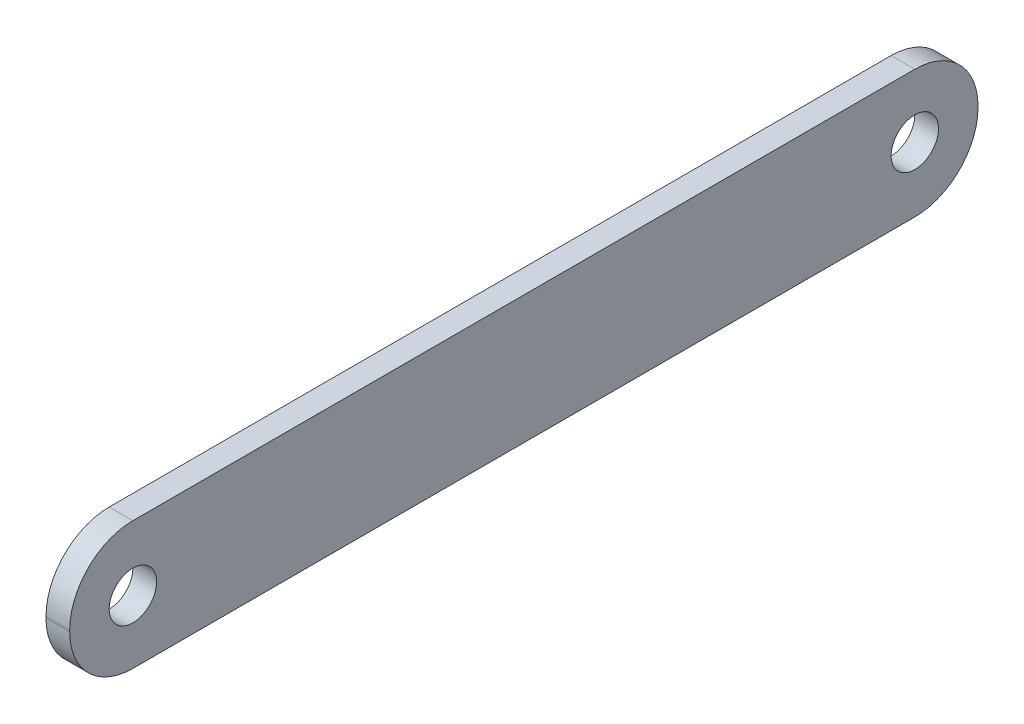
ISO-10303-21;
HEADER;
FILE_DESCRIPTION(('STEP AP214'),'2;1');
FILE_NAME('part.step','',(''),(''),'','','');
FILE_SCHEMA(('AUTOMOTIVE_DESIGN { 1 0 10303 214 1 1 1 1 }'));
ENDSEC;
DATA;
#1=APPLICATION_CONTEXT('core data for automotive mechanical design processes');
#2=APPLICATION_PROTOCOL_DEFINITION('international standard','automotive_design',2000,#1);
#3=PRODUCT_CONTEXT('',#1,'mechanical');
#4=PRODUCT('Part','Part','',(#3));
#5=PRODUCT_RELATED_PRODUCT_CATEGORY('part','',(#4));
#6=PRODUCT_DEFINITION_FORMATION('','',#4);
#7=PRODUCT_DEFINITION_CONTEXT('part definition',#1,'design');
#8=PRODUCT_DEFINITION('design','',#6,#7);
#9=PRODUCT_DEFINITION_SHAPE('','',#8);
#10=(LENGTH_UNIT() NAMED_UNIT(*) SI_UNIT(.MILLI.,.METRE.));
#11=(NAMED_UNIT(*) PLANE_ANGLE_UNIT() SI_UNIT($,.RADIAN.));
#12=(NAMED_UNIT(*) SI_UNIT($,.STERADIAN.) SOLID_ANGLE_UNIT());
#13=UNCERTAINTY_MEASURE_WITH_UNIT(LENGTH_MEASURE(1.E-05),#10,'distance_accuracy_value','');
#14=(GEOMETRIC_REPRESENTATION_CONTEXT(3) GLOBAL_UNCERTAINTY_ASSIGNED_CONTEXT((#13)) GLOBAL_UNIT_ASSIGNED_CONTEXT((#10,
#11,#12)) REPRESENTATION_CONTEXT('',''));
#15=CARTESIAN_POINT('',(0.,0.,0.));
#16=DIRECTION('',(0.,0.,1.));
#17=DIRECTION('',(1.,0.,0.));
#18=AXIS2_PLACEMENT_3D('',#15,#16,#17);
#19=CARTESIAN_POINT('',(3.,0.100000000000001,-49.5));
#20=DIRECTION('',(-1.,0.,0.));
#21=DIRECTION('',(0.,0.,1.));
#22=AXIS2_PLACEMENT_3D('',#19,#20,#21);
#23=PLANE('',#22);
#24=CARTESIAN_POINT('',(3.,0.100000000000001,-49.5));
#25=DIRECTION('',(1.,0.,0.));
#26=DIRECTION('',(0.,0.,1.));
#27=AXIS2_PLACEMENT_3D('',#24,#25,#26);
#28=CIRCLE('',#27,7.99999999999999);
#29=CARTESIAN_POINT('',(3.,0.100000000000002,-57.5));
#30=VERTEX_POINT('',#29);
#31=CARTESIAN_POINT('',(3.,8.1,-49.5));
#32=VERTEX_POINT('',#31);
#33=EDGE_CURVE('E153',#30,#32,#28,.T.);
#34=ORIENTED_EDGE('',*,*,#33,.T.);
#35=DIRECTION('',(0.,0.,1.));
#36=VECTOR('',#35,1.);
#37=CARTESIAN_POINT('',(3.,8.1,49.5));
#38=LINE('',#37,#36);
#39=CARTESIAN_POINT('',(3.,8.1,49.5));
#40=VERTEX_POINT('',#39);
#41=EDGE_CURVE('E101',#32,#40,#38,.T.);
#42=ORIENTED_EDGE('',*,*,#41,.T.);
#43=CARTESIAN_POINT('',(3.,0.100000000000001,49.5));
#44=DIRECTION('',(1.,0.,0.));
#45=DIRECTION('',(0.,0.,-1.));
#46=AXIS2_PLACEMENT_3D('',#43,#44,#45);
#47=CIRCLE('',#46,8.);
#48=CARTESIAN_POINT('',(3.,0.100000000000002,57.5));
#49=VERTEX_POINT('',#48);
#50=EDGE_CURVE('E168',#40,#49,#47,.T.);
#51=ORIENTED_EDGE('',*,*,#50,.T.);
#52=DIRECTION('',(0.,-1.,0.));
#53=VECTOR('',#52,1.);
#54=CARTESIAN_POINT('',(3.,0.1,57.5));
#55=LINE('',#54,#53);
#56=CARTESIAN_POINT('',(3.,-0.0999999999999986,57.5));
#57=VERTEX_POINT('',#56);
#58=EDGE_CURVE('E181',#49,#57,#55,.T.);
#59=ORIENTED_EDGE('',*,*,#58,.T.);
#60=CARTESIAN_POINT('',(3.,-0.0999999999999977,49.5));
#61=DIRECTION('',(1.,0.,0.));
#62=DIRECTION('',(0.,0.,-1.));
#63=AXIS2_PLACEMENT_3D('',#60,#61,#62);
#64=CIRCLE('',#63,8.);
#65=CARTESIAN_POINT('',(3.,-8.09999999999999,49.5));
#66=VERTEX_POINT('',#65);
#67=EDGE_CURVE('E120',#57,#66,#64,.T.);
#68=ORIENTED_EDGE('',*,*,#67,.T.);
#69=DIRECTION('',(0.,0.,-1.));
#70=VECTOR('',#69,1.);
#71=CARTESIAN_POINT('',(3.,-8.1,49.5));
#72=LINE('',#71,#70);
#73=CARTESIAN_POINT('',(3.,-8.1,-49.5));
#74=VERTEX_POINT('',#73);
#75=EDGE_CURVE('E114',#66,#74,#72,.T.);
#76=ORIENTED_EDGE('',*,*,#75,.T.);
#77=CARTESIAN_POINT('',(3.,-0.0999999999999977,-49.5));
#78=DIRECTION('',(1.,0.,0.));
#79=DIRECTION('',(0.,0.,-1.));
#80=AXIS2_PLACEMENT_3D('',#77,#78,#79);
#81=CIRCLE('',#80,8.);
#82=CARTESIAN_POINT('',(3.,-0.0999999999999977,-57.5));
#83=VERTEX_POINT('',#82);
#84=EDGE_CURVE('E118',#74,#83,#81,.T.);
#85=ORIENTED_EDGE('',*,*,#84,.T.);
#86=DIRECTION('',(0.,1.,0.));
#87=VECTOR('',#86,1.);
#88=CARTESIAN_POINT('',(3.,0.100000000000002,-57.5));
#89=LINE('',#88,#87);
#90=EDGE_CURVE('E58',#83,#30,#89,.T.);
#91=ORIENTED_EDGE('',*,*,#90,.T.);
#92=EDGE_LOOP('',(#34,#42,#51,#59,#68,#76,#85,#91));
#93=FACE_BOUND('',#92,.T.);
#94=CARTESIAN_POINT('',(3.,-0.0999999999999977,49.5));
#95=DIRECTION('',(1.,0.,0.));
#96=DIRECTION('',(0.,0.,-1.));
#97=AXIS2_PLACEMENT_3D('',#94,#95,#96);
#98=CIRCLE('',#97,3.00000000000001);
#99=CARTESIAN_POINT('',(3.,-0.0999999999999977,46.5));
#100=VERTEX_POINT('',#99);
#101=EDGE_CURVE('E142',#100,#100,#98,.T.);
#102=ORIENTED_EDGE('',*,*,#101,.F.);
#103=EDGE_LOOP('',(#102));
#104=FACE_BOUND('',#103,.T.);
#105=CARTESIAN_POINT('',(3.,0.100000000000001,-49.5));
#106=DIRECTION('',(1.,0.,0.));
#107=DIRECTION('',(0.,0.,-1.));
#108=AXIS2_PLACEMENT_3D('',#105,#106,#107);
#109=CIRCLE('',#108,3.00000000000001);
#110=CARTESIAN_POINT('',(3.,0.100000000000001,-52.5));
#111=VERTEX_POINT('',#110);
#112=EDGE_CURVE('E190',#111,#111,#109,.T.);
#113=ORIENTED_EDGE('',*,*,#112,.F.);
#114=EDGE_LOOP('',(#113));
#115=FACE_BOUND('',#114,.T.);
#116=ADVANCED_FACE('F41',(#93,#104,#115),#23,.F.);
#117=CARTESIAN_POINT('',(0.,0.100000000000001,-49.5));
#118=DIRECTION('',(-1.,0.,0.));
#119=DIRECTION('',(0.,0.,1.));
#120=AXIS2_PLACEMENT_3D('',#117,#118,#119);
#121=PLANE('',#120);
#122=CARTESIAN_POINT('',(0.,-0.0999999999999977,49.5));
#123=DIRECTION('',(1.,0.,0.));
#124=DIRECTION('',(0.,0.,-1.));
#125=AXIS2_PLACEMENT_3D('',#122,#123,#124);
#126=CIRCLE('',#125,3.00000000000001);
#127=CARTESIAN_POINT('',(0.,-0.0999999999999977,46.5));
#128=VERTEX_POINT('',#127);
#129=EDGE_CURVE('E187',#128,#128,#126,.T.);
#130=ORIENTED_EDGE('',*,*,#129,.T.);
#131=EDGE_LOOP('',(#130));
#132=FACE_BOUND('',#131,.T.);
#133=CARTESIAN_POINT('',(0.,0.100000000000001,-49.5));
#134=DIRECTION('',(1.,0.,0.));
#135=DIRECTION('',(0.,0.,1.));
#136=AXIS2_PLACEMENT_3D('',#133,#134,#135);
#137=CIRCLE('',#136,7.99999999999999);
#138=CARTESIAN_POINT('',(0.,0.100000000000002,-57.5));
#139=VERTEX_POINT('',#138);
#140=CARTESIAN_POINT('',(0.,8.1,-49.5));
#141=VERTEX_POINT('',#140);
#142=EDGE_CURVE('E138',#139,#141,#137,.T.);
#143=ORIENTED_EDGE('',*,*,#142,.F.);
#144=DIRECTION('',(0.,1.,0.));
#145=VECTOR('',#144,1.);
#146=CARTESIAN_POINT('',(0.,0.100000000000002,-57.5));
#147=LINE('',#146,#145);
#148=CARTESIAN_POINT('',(0.,-0.0999999999999977,-57.5));
#149=VERTEX_POINT('',#148);
#150=EDGE_CURVE('E93',#149,#139,#147,.T.);
#151=ORIENTED_EDGE('',*,*,#150,.F.);
#152=CARTESIAN_POINT('',(0.,-0.0999999999999977,-49.5));
#153=DIRECTION('',(1.,0.,0.));
#154=DIRECTION('',(0.,0.,-1.));
#155=AXIS2_PLACEMENT_3D('',#152,#153,#154);
#156=CIRCLE('',#155,8.);
#157=CARTESIAN_POINT('',(0.,-8.1,-49.5));
#158=VERTEX_POINT('',#157);
#159=EDGE_CURVE('E87',#158,#149,#156,.T.);
#160=ORIENTED_EDGE('',*,*,#159,.F.);
#161=DIRECTION('',(0.,0.,-1.));
#162=VECTOR('',#161,1.);
#163=CARTESIAN_POINT('',(0.,-8.1,49.5));
#164=LINE('',#163,#162);
#165=CARTESIAN_POINT('',(0.,-8.09999999999999,49.5));
#166=VERTEX_POINT('',#165);
#167=EDGE_CURVE('E128',#166,#158,#164,.T.);
#168=ORIENTED_EDGE('',*,*,#167,.F.);
#169=CARTESIAN_POINT('',(0.,-0.0999999999999977,49.5));
#170=DIRECTION('',(1.,0.,0.));
#171=DIRECTION('',(0.,0.,-1.));
#172=AXIS2_PLACEMENT_3D('',#169,#170,#171);
#173=CIRCLE('',#172,8.);
#174=CARTESIAN_POINT('',(0.,-0.0999999999999986,57.5));
#175=VERTEX_POINT('',#174);
#176=EDGE_CURVE('E148',#175,#166,#173,.T.);
#177=ORIENTED_EDGE('',*,*,#176,.F.);
#178=DIRECTION('',(0.,-1.,0.));
#179=VECTOR('',#178,1.);
#180=CARTESIAN_POINT('',(0.,0.1,57.5));
#181=LINE('',#180,#179);
#182=CARTESIAN_POINT('',(0.,0.100000000000002,57.5));
#183=VERTEX_POINT('',#182);
#184=EDGE_CURVE('E146',#183,#175,#181,.T.);
#185=ORIENTED_EDGE('',*,*,#184,.F.);
#186=CARTESIAN_POINT('',(0.,0.100000000000001,49.5));
#187=DIRECTION('',(1.,0.,0.));
#188=DIRECTION('',(0.,0.,-1.));
#189=AXIS2_PLACEMENT_3D('',#186,#187,#188);
#190=CIRCLE('',#189,8.);
#191=CARTESIAN_POINT('',(0.,8.1,49.5));
#192=VERTEX_POINT('',#191);
#193=EDGE_CURVE('E144',#192,#183,#190,.T.);
#194=ORIENTED_EDGE('',*,*,#193,.F.);
#195=DIRECTION('',(0.,0.,1.));
#196=VECTOR('',#195,1.);
#197=CARTESIAN_POINT('',(0.,8.1,49.5));
#198=LINE('',#197,#196);
#199=EDGE_CURVE('E141',#141,#192,#198,.T.);
#200=ORIENTED_EDGE('',*,*,#199,.F.);
#201=EDGE_LOOP('',(#143,#151,#160,#168,#177,#185,#194,#200));
#202=FACE_BOUND('',#201,.T.);
#203=CARTESIAN_POINT('',(0.,0.100000000000001,-49.5));
#204=DIRECTION('',(1.,0.,0.));
#205=DIRECTION('',(0.,0.,-1.));
#206=AXIS2_PLACEMENT_3D('',#203,#204,#205);
#207=CIRCLE('',#206,3.00000000000001);
#208=CARTESIAN_POINT('',(0.,0.100000000000001,-52.5));
#209=VERTEX_POINT('',#208);
#210=EDGE_CURVE('E193',#209,#209,#207,.T.);
#211=ORIENTED_EDGE('',*,*,#210,.T.);
#212=EDGE_LOOP('',(#211));
#213=FACE_BOUND('',#212,.T.);
#214=ADVANCED_FACE('F172',(#132,#202,#213),#121,.T.);
#215=CARTESIAN_POINT('',(3.,0.100000000000001,-49.5));
#216=DIRECTION('',(-1.,0.,0.));
#217=DIRECTION('',(0.,0.,1.));
#218=AXIS2_PLACEMENT_3D('',#215,#216,#217);
#219=CYLINDRICAL_SURFACE('',#218,7.99999999999999);
#220=ORIENTED_EDGE('',*,*,#142,.T.);
#221=DIRECTION('',(-1.,0.,0.));
#222=VECTOR('',#221,1.);
#223=CARTESIAN_POINT('',(3.,8.1,-49.5));
#224=LINE('',#223,#222);
#225=EDGE_CURVE('E11',#32,#141,#224,.T.);
#226=ORIENTED_EDGE('',*,*,#225,.F.);
#227=ORIENTED_EDGE('',*,*,#33,.F.);
#228=DIRECTION('',(-1.,0.,0.));
#229=VECTOR('',#228,1.);
#230=CARTESIAN_POINT('',(3.,0.100000000000002,-57.5));
#231=LINE('',#230,#229);
#232=EDGE_CURVE('E134',#30,#139,#231,.T.);
#233=ORIENTED_EDGE('',*,*,#232,.T.);
#234=EDGE_LOOP('',(#220,#226,#227,#233));
#235=FACE_BOUND('',#234,.T.);
#236=ADVANCED_FACE('F43',(#235),#219,.T.);
#237=CARTESIAN_POINT('',(3.,8.1,49.5));
#238=DIRECTION('',(0.,-1.,0.));
#239=DIRECTION('',(0.,0.,-1.));
#240=AXIS2_PLACEMENT_3D('',#237,#238,#239);
#241=PLANE('',#240);
#242=ORIENTED_EDGE('',*,*,#199,.T.);
#243=DIRECTION('',(-1.,0.,0.));
#244=VECTOR('',#243,1.);
#245=CARTESIAN_POINT('',(3.,8.1,49.5));
#246=LINE('',#245,#244);
#247=EDGE_CURVE('E50',#40,#192,#246,.T.);
#248=ORIENTED_EDGE('',*,*,#247,.F.);
#249=ORIENTED_EDGE('',*,*,#41,.F.);
#250=ORIENTED_EDGE('',*,*,#225,.T.);
#251=EDGE_LOOP('',(#242,#248,#249,#250));
#252=FACE_BOUND('',#251,.T.);
#253=ADVANCED_FACE('F225',(#252),#241,.F.);
#254=CARTESIAN_POINT('',(3.,0.100000000000001,49.5));
#255=DIRECTION('',(-1.,0.,0.));
#256=DIRECTION('',(0.,0.,1.));
#257=AXIS2_PLACEMENT_3D('',#254,#255,#256);
#258=CYLINDRICAL_SURFACE('',#257,8.);
#259=ORIENTED_EDGE('',*,*,#193,.T.);
#260=DIRECTION('',(-1.,0.,0.));
#261=VECTOR('',#260,1.);
#262=CARTESIAN_POINT('',(3.,0.100000000000002,57.5));
#263=LINE('',#262,#261);
#264=EDGE_CURVE('E160',#49,#183,#263,.T.);
#265=ORIENTED_EDGE('',*,*,#264,.F.);
#266=ORIENTED_EDGE('',*,*,#50,.F.);
#267=ORIENTED_EDGE('',*,*,#247,.T.);
#268=EDGE_LOOP('',(#259,#265,#266,#267));
#269=FACE_BOUND('',#268,.T.);
#270=ADVANCED_FACE('F166',(#269),#258,.T.);
#271=CARTESIAN_POINT('',(3.,0.1,57.5));
#272=DIRECTION('',(0.,0.,-1.));
#273=DIRECTION('',(-1.,0.,0.));
#274=AXIS2_PLACEMENT_3D('',#271,#272,#273);
#275=PLANE('',#274);
#276=ORIENTED_EDGE('',*,*,#184,.T.);
#277=DIRECTION('',(-1.,0.,0.));
#278=VECTOR('',#277,1.);
#279=CARTESIAN_POINT('',(3.,-0.0999999999999986,57.5));
#280=LINE('',#279,#278);
#281=EDGE_CURVE('E157',#57,#175,#280,.T.);
#282=ORIENTED_EDGE('',*,*,#281,.F.);
#283=ORIENTED_EDGE('',*,*,#58,.F.);
#284=ORIENTED_EDGE('',*,*,#264,.T.);
#285=EDGE_LOOP('',(#276,#282,#283,#284));
#286=FACE_BOUND('',#285,.T.);
#287=ADVANCED_FACE('F177',(#286),#275,.F.);
#288=CARTESIAN_POINT('',(3.,-0.0999999999999977,49.5));
#289=DIRECTION('',(-1.,0.,0.));
#290=DIRECTION('',(0.,0.,1.));
#291=AXIS2_PLACEMENT_3D('',#288,#289,#290);
#292=CYLINDRICAL_SURFACE('',#291,8.);
#293=ORIENTED_EDGE('',*,*,#176,.T.);
#294=DIRECTION('',(-1.,0.,0.));
#295=VECTOR('',#294,1.);
#296=CARTESIAN_POINT('',(3.,-8.09999999999999,49.5));
#297=LINE('',#296,#295);
#298=EDGE_CURVE('E129',#66,#166,#297,.T.);
#299=ORIENTED_EDGE('',*,*,#298,.F.);
#300=ORIENTED_EDGE('',*,*,#67,.F.);
#301=ORIENTED_EDGE('',*,*,#281,.T.);
#302=EDGE_LOOP('',(#293,#299,#300,#301));
#303=FACE_BOUND('',#302,.T.);
#304=ADVANCED_FACE('F180',(#303),#292,.T.);
#305=CARTESIAN_POINT('',(3.,-8.1,49.5));
#306=DIRECTION('',(0.,1.,0.));
#307=DIRECTION('',(0.,0.,1.));
#308=AXIS2_PLACEMENT_3D('',#305,#306,#307);
#309=PLANE('',#308);
#310=ORIENTED_EDGE('',*,*,#167,.T.);
#311=DIRECTION('',(-1.,0.,0.));
#312=VECTOR('',#311,1.);
#313=CARTESIAN_POINT('',(3.,-8.1,-49.5));
#314=LINE('',#313,#312);
#315=EDGE_CURVE('E125',#74,#158,#314,.T.);
#316=ORIENTED_EDGE('',*,*,#315,.F.);
#317=ORIENTED_EDGE('',*,*,#75,.F.);
#318=ORIENTED_EDGE('',*,*,#298,.T.);
#319=EDGE_LOOP('',(#310,#316,#317,#318));
#320=FACE_BOUND('',#319,.T.);
#321=ADVANCED_FACE('F126',(#320),#309,.F.);
#322=CARTESIAN_POINT('',(3.,-0.0999999999999977,-49.5));
#323=DIRECTION('',(-1.,0.,0.));
#324=DIRECTION('',(0.,0.,1.));
#325=AXIS2_PLACEMENT_3D('',#322,#323,#324);
#326=CYLINDRICAL_SURFACE('',#325,8.);
#327=ORIENTED_EDGE('',*,*,#159,.T.);
#328=DIRECTION('',(-1.,0.,0.));
#329=VECTOR('',#328,1.);
#330=CARTESIAN_POINT('',(3.,-0.0999999999999977,-57.5));
#331=LINE('',#330,#329);
#332=EDGE_CURVE('E130',#83,#149,#331,.T.);
#333=ORIENTED_EDGE('',*,*,#332,.F.);
#334=ORIENTED_EDGE('',*,*,#84,.F.);
#335=ORIENTED_EDGE('',*,*,#315,.T.);
#336=EDGE_LOOP('',(#327,#333,#334,#335));
#337=FACE_BOUND('',#336,.T.);
#338=ADVANCED_FACE('F132',(#337),#326,.T.);
#339=CARTESIAN_POINT('',(3.,0.100000000000002,-57.5));
#340=DIRECTION('',(0.,0.,1.));
#341=DIRECTION('',(0.,-1.,0.));
#342=AXIS2_PLACEMENT_3D('',#339,#340,#341);
#343=PLANE('',#342);
#344=ORIENTED_EDGE('',*,*,#150,.T.);
#345=ORIENTED_EDGE('',*,*,#232,.F.);
#346=ORIENTED_EDGE('',*,*,#90,.F.);
#347=ORIENTED_EDGE('',*,*,#332,.T.);
#348=EDGE_LOOP('',(#344,#345,#346,#347));
#349=FACE_BOUND('',#348,.T.);
#350=ADVANCED_FACE('F213',(#349),#343,.F.);
#351=CARTESIAN_POINT('',(3.,-0.0999999999999977,49.5));
#352=DIRECTION('',(-1.,0.,0.));
#353=DIRECTION('',(0.,0.,1.));
#354=AXIS2_PLACEMENT_3D('',#351,#352,#353);
#355=CYLINDRICAL_SURFACE('',#354,3.00000000000001);
#356=ORIENTED_EDGE('',*,*,#101,.T.);
#357=EDGE_LOOP('',(#356));
#358=FACE_BOUND('',#357,.T.);
#359=ORIENTED_EDGE('',*,*,#129,.F.);
#360=EDGE_LOOP('',(#359));
#361=FACE_BOUND('',#360,.T.);
#362=ADVANCED_FACE('F210',(#358,#361),#355,.F.);
#363=CARTESIAN_POINT('',(3.,0.100000000000001,-49.5));
#364=DIRECTION('',(-1.,0.,0.));
#365=DIRECTION('',(0.,0.,1.));
#366=AXIS2_PLACEMENT_3D('',#363,#364,#365);
#367=CYLINDRICAL_SURFACE('',#366,3.00000000000001);
#368=ORIENTED_EDGE('',*,*,#112,.T.);
#369=EDGE_LOOP('',(#368));
#370=FACE_BOUND('',#369,.T.);
#371=ORIENTED_EDGE('',*,*,#210,.F.);
#372=EDGE_LOOP('',(#371));
#373=FACE_BOUND('',#372,.T.);
#374=ADVANCED_FACE('F199',(#370,#373),#367,.F.);
#375=CLOSED_SHELL('',(#116,#214,#236,#253,#270,#287,#304,#321,#338,#350,#362,#374));
#376=MANIFOLD_SOLID_BREP('B2',#375);
#377=ADVANCED_BREP_SHAPE_REPRESENTATION('',(#18,#376),#14);
#378=SHAPE_DEFINITION_REPRESENTATION(#9,#377);
ENDSEC;
END-ISO-10303-21;
